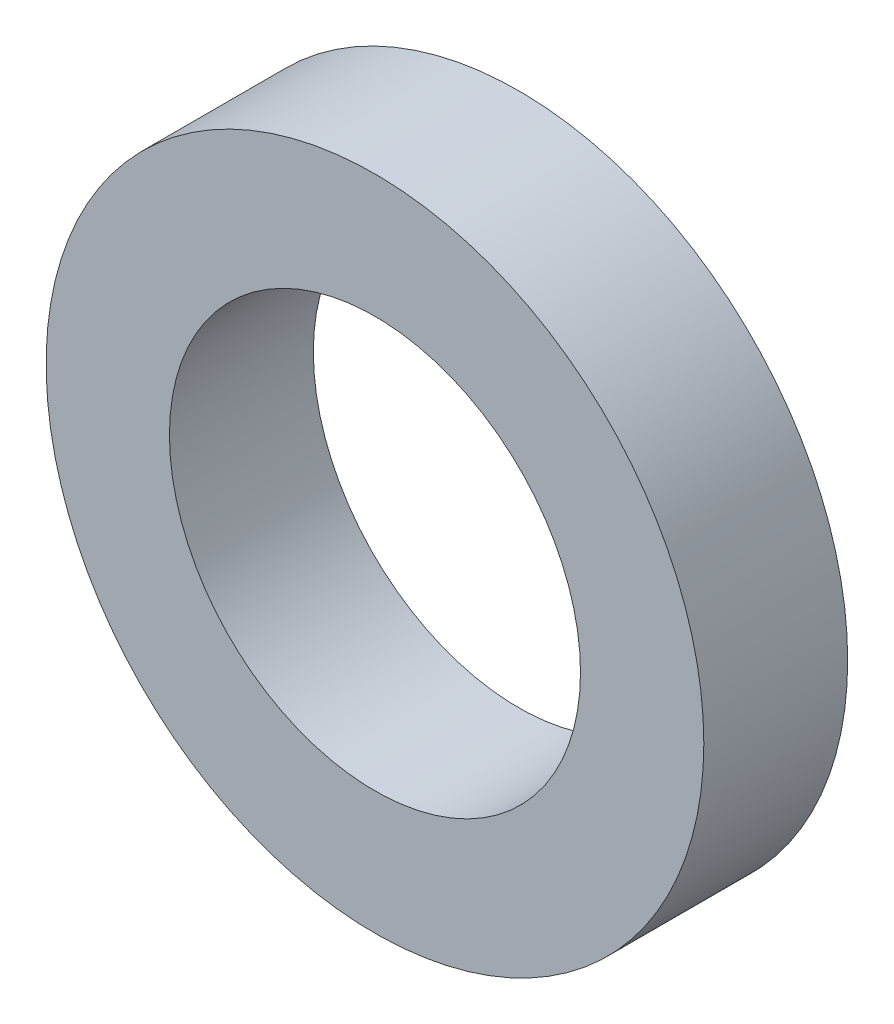
ISO-10303-21;
HEADER;
FILE_DESCRIPTION(('STEP AP214'),'2;1');
FILE_NAME('part.step','',(''),(''),'','','');
FILE_SCHEMA(('AUTOMOTIVE_DESIGN { 1 0 10303 214 1 1 1 1 }'));
ENDSEC;
DATA;
#1=APPLICATION_CONTEXT('core data for automotive mechanical design processes');
#2=APPLICATION_PROTOCOL_DEFINITION('international standard','automotive_design',2000,#1);
#3=PRODUCT_CONTEXT('',#1,'mechanical');
#4=PRODUCT('Part','Part','',(#3));
#5=PRODUCT_RELATED_PRODUCT_CATEGORY('part','',(#4));
#6=PRODUCT_DEFINITION_FORMATION('','',#4);
#7=PRODUCT_DEFINITION_CONTEXT('part definition',#1,'design');
#8=PRODUCT_DEFINITION('design','',#6,#7);
#9=PRODUCT_DEFINITION_SHAPE('','',#8);
#10=(LENGTH_UNIT() NAMED_UNIT(*) SI_UNIT(.MILLI.,.METRE.));
#11=(NAMED_UNIT(*) PLANE_ANGLE_UNIT() SI_UNIT($,.RADIAN.));
#12=(NAMED_UNIT(*) SI_UNIT($,.STERADIAN.) SOLID_ANGLE_UNIT());
#13=UNCERTAINTY_MEASURE_WITH_UNIT(LENGTH_MEASURE(1.E-05),#10,'distance_accuracy_value','');
#14=(GEOMETRIC_REPRESENTATION_CONTEXT(3) GLOBAL_UNCERTAINTY_ASSIGNED_CONTEXT((#13)) GLOBAL_UNIT_ASSIGNED_CONTEXT((#10,
#11,#12)) REPRESENTATION_CONTEXT('',''));
#15=CARTESIAN_POINT('',(0.,0.,0.));
#16=DIRECTION('',(0.,0.,1.));
#17=DIRECTION('',(1.,0.,0.));
#18=AXIS2_PLACEMENT_3D('',#15,#16,#17);
#19=CARTESIAN_POINT('',(0.,0.,7.));
#20=DIRECTION('',(0.,0.,1.));
#21=DIRECTION('',(1.,0.,0.));
#22=AXIS2_PLACEMENT_3D('',#19,#20,#21);
#23=PLANE('',#22);
#24=CARTESIAN_POINT('',(0.,0.,7.));
#25=DIRECTION('',(0.,0.,1.));
#26=DIRECTION('',(1.,0.,0.));
#27=AXIS2_PLACEMENT_3D('',#24,#25,#26);
#28=CIRCLE('',#27,16.);
#29=CARTESIAN_POINT('',(16.,0.,7.));
#30=VERTEX_POINT('',#29);
#31=EDGE_CURVE('E10',#30,#30,#28,.T.);
#32=ORIENTED_EDGE('',*,*,#31,.T.);
#33=EDGE_LOOP('',(#32));
#34=FACE_BOUND('',#33,.T.);
#35=CARTESIAN_POINT('',(0.,0.,7.));
#36=DIRECTION('',(0.,0.,1.));
#37=DIRECTION('',(1.,0.,0.));
#38=AXIS2_PLACEMENT_3D('',#35,#36,#37);
#39=CIRCLE('',#38,10.);
#40=CARTESIAN_POINT('',(10.,0.,7.));
#41=VERTEX_POINT('',#40);
#42=EDGE_CURVE('E42',#41,#41,#39,.T.);
#43=ORIENTED_EDGE('',*,*,#42,.F.);
#44=EDGE_LOOP('',(#43));
#45=FACE_BOUND('',#44,.T.);
#46=ADVANCED_FACE('F31',(#34,#45),#23,.T.);
#47=CARTESIAN_POINT('',(0.,0.,0.));
#48=DIRECTION('',(0.,0.,1.));
#49=DIRECTION('',(1.,0.,0.));
#50=AXIS2_PLACEMENT_3D('',#47,#48,#49);
#51=PLANE('',#50);
#52=CARTESIAN_POINT('',(0.,0.,0.));
#53=DIRECTION('',(0.,0.,1.));
#54=DIRECTION('',(1.,0.,0.));
#55=AXIS2_PLACEMENT_3D('',#52,#53,#54);
#56=CIRCLE('',#55,16.);
#57=CARTESIAN_POINT('',(16.,0.,0.));
#58=VERTEX_POINT('',#57);
#59=EDGE_CURVE('E35',#58,#58,#56,.T.);
#60=ORIENTED_EDGE('',*,*,#59,.F.);
#61=EDGE_LOOP('',(#60));
#62=FACE_BOUND('',#61,.T.);
#63=CARTESIAN_POINT('',(0.,0.,0.));
#64=DIRECTION('',(0.,0.,1.));
#65=DIRECTION('',(1.,0.,0.));
#66=AXIS2_PLACEMENT_3D('',#63,#64,#65);
#67=CIRCLE('',#66,10.);
#68=CARTESIAN_POINT('',(10.,0.,0.));
#69=VERTEX_POINT('',#68);
#70=EDGE_CURVE('E44',#69,#69,#67,.T.);
#71=ORIENTED_EDGE('',*,*,#70,.T.);
#72=EDGE_LOOP('',(#71));
#73=FACE_BOUND('',#72,.T.);
#74=ADVANCED_FACE('F54',(#62,#73),#51,.F.);
#75=CARTESIAN_POINT('',(0.,0.,7.));
#76=DIRECTION('',(0.,0.,-1.));
#77=DIRECTION('',(-1.,0.,0.));
#78=AXIS2_PLACEMENT_3D('',#75,#76,#77);
#79=CYLINDRICAL_SURFACE('',#78,16.);
#80=ORIENTED_EDGE('',*,*,#31,.F.);
#81=EDGE_LOOP('',(#80));
#82=FACE_BOUND('',#81,.T.);
#83=ORIENTED_EDGE('',*,*,#59,.T.);
#84=EDGE_LOOP('',(#83));
#85=FACE_BOUND('',#84,.T.);
#86=ADVANCED_FACE('F33',(#82,#85),#79,.T.);
#87=CARTESIAN_POINT('',(0.,0.,7.));
#88=DIRECTION('',(0.,0.,-1.));
#89=DIRECTION('',(-1.,0.,0.));
#90=AXIS2_PLACEMENT_3D('',#87,#88,#89);
#91=CYLINDRICAL_SURFACE('',#90,10.);
#92=ORIENTED_EDGE('',*,*,#42,.T.);
#93=EDGE_LOOP('',(#92));
#94=FACE_BOUND('',#93,.T.);
#95=ORIENTED_EDGE('',*,*,#70,.F.);
#96=EDGE_LOOP('',(#95));
#97=FACE_BOUND('',#96,.T.);
#98=ADVANCED_FACE('F50',(#94,#97),#91,.F.);
#99=CLOSED_SHELL('',(#46,#74,#86,#98));
#100=MANIFOLD_SOLID_BREP('B2',#99);
#101=ADVANCED_BREP_SHAPE_REPRESENTATION('',(#18,#100),#14);
#102=SHAPE_DEFINITION_REPRESENTATION(#9,#101);
ENDSEC;
END-ISO-10303-21;
